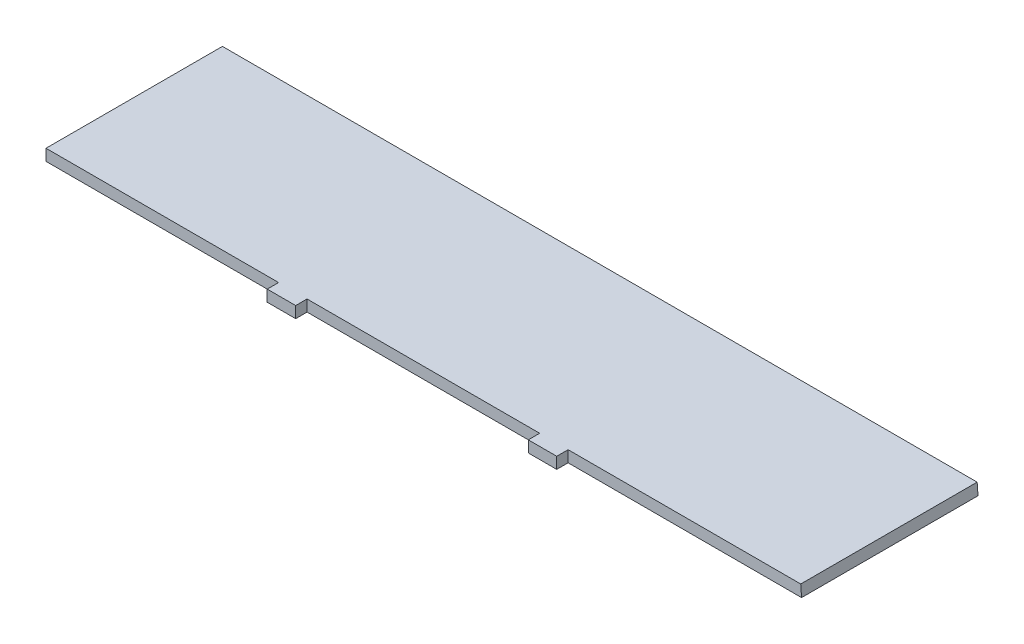
ISO-10303-21;
HEADER;
FILE_DESCRIPTION(('STEP AP214'),'2;1');
FILE_NAME('part.step','',(''),(''),'','','');
FILE_SCHEMA(('AUTOMOTIVE_DESIGN { 1 0 10303 214 1 1 1 1 }'));
ENDSEC;
DATA;
#1=APPLICATION_CONTEXT('core data for automotive mechanical design processes');
#2=APPLICATION_PROTOCOL_DEFINITION('international standard','automotive_design',2000,#1);
#3=PRODUCT_CONTEXT('',#1,'mechanical');
#4=PRODUCT('Part','Part','',(#3));
#5=PRODUCT_RELATED_PRODUCT_CATEGORY('part','',(#4));
#6=PRODUCT_DEFINITION_FORMATION('','',#4);
#7=PRODUCT_DEFINITION_CONTEXT('part definition',#1,'design');
#8=PRODUCT_DEFINITION('design','',#6,#7);
#9=PRODUCT_DEFINITION_SHAPE('','',#8);
#10=(LENGTH_UNIT() NAMED_UNIT(*) SI_UNIT(.MILLI.,.METRE.));
#11=(NAMED_UNIT(*) PLANE_ANGLE_UNIT() SI_UNIT($,.RADIAN.));
#12=(NAMED_UNIT(*) SI_UNIT($,.STERADIAN.) SOLID_ANGLE_UNIT());
#13=UNCERTAINTY_MEASURE_WITH_UNIT(LENGTH_MEASURE(1.E-05),#10,'distance_accuracy_value','');
#14=(GEOMETRIC_REPRESENTATION_CONTEXT(3) GLOBAL_UNCERTAINTY_ASSIGNED_CONTEXT((#13)) GLOBAL_UNIT_ASSIGNED_CONTEXT((#10,
#11,#12)) REPRESENTATION_CONTEXT('',''));
#15=CARTESIAN_POINT('',(0.,0.,0.));
#16=DIRECTION('',(0.,0.,1.));
#17=DIRECTION('',(1.,0.,0.));
#18=AXIS2_PLACEMENT_3D('',#15,#16,#17);
#19=CARTESIAN_POINT('',(380.,-80.,-940.));
#20=DIRECTION('',(0.,0.,-1.));
#21=DIRECTION('',(-1.,0.,0.));
#22=AXIS2_PLACEMENT_3D('',#19,#20,#21);
#23=PLANE('',#22);
#24=DIRECTION('',(1.,0.,0.));
#25=VECTOR('',#24,1.);
#26=CARTESIAN_POINT('',(-420.,-148.,-940.));
#27=LINE('',#26,#25);
#28=CARTESIAN_POINT('',(-376.128490076666,-148.,-940.));
#29=VERTEX_POINT('',#28);
#30=CARTESIAN_POINT('',(-335.256980153332,-148.,-940.));
#31=VERTEX_POINT('',#30);
#32=EDGE_CURVE('E67',#29,#31,#27,.T.);
#33=ORIENTED_EDGE('',*,*,#32,.F.);
#34=DIRECTION('',(0.,1.,0.));
#35=VECTOR('',#34,1.);
#36=CARTESIAN_POINT('',(-376.128490076666,-150.,-940.));
#37=LINE('',#36,#35);
#38=CARTESIAN_POINT('',(-376.128490076666,-150.,-940.));
#39=VERTEX_POINT('',#38);
#40=EDGE_CURVE('E139',#39,#29,#37,.T.);
#41=ORIENTED_EDGE('',*,*,#40,.F.);
#42=DIRECTION('',(-1.,0.,0.));
#43=VECTOR('',#42,1.);
#44=CARTESIAN_POINT('',(380.,-150.,-940.));
#45=LINE('',#44,#43);
#46=CARTESIAN_POINT('',(-335.256980153332,-150.,-940.));
#47=VERTEX_POINT('',#46);
#48=EDGE_CURVE('E148',#47,#39,#45,.T.);
#49=ORIENTED_EDGE('',*,*,#48,.F.);
#50=DIRECTION('',(0.,1.,0.));
#51=VECTOR('',#50,1.);
#52=CARTESIAN_POINT('',(-335.256980153332,-150.,-940.));
#53=LINE('',#52,#51);
#54=EDGE_CURVE('E203',#47,#31,#53,.T.);
#55=ORIENTED_EDGE('',*,*,#54,.T.);
#56=EDGE_LOOP('',(#33,#41,#49,#55));
#57=FACE_BOUND('',#56,.T.);
#58=ADVANCED_FACE('F42',(#57),#23,.F.);
#59=DIRECTION('',(0.,1.,0.));
#60=VECTOR('',#59,1.);
#61=CARTESIAN_POINT('',(-330.256980153332,-150.,-940.));
#62=LINE('',#61,#60);
#63=CARTESIAN_POINT('',(-330.256980153332,-150.,-940.));
#64=VERTEX_POINT('',#63);
#65=CARTESIAN_POINT('',(-330.256980153332,-148.,-940.));
#66=VERTEX_POINT('',#65);
#67=EDGE_CURVE('E201',#64,#66,#62,.T.);
#68=ORIENTED_EDGE('',*,*,#67,.F.);
#69=CARTESIAN_POINT('',(-289.236378340623,-150.,-940.));
#70=VERTEX_POINT('',#69);
#71=EDGE_CURVE('E158',#70,#64,#45,.T.);
#72=ORIENTED_EDGE('',*,*,#71,.F.);
#73=DIRECTION('',(0.0743396744332568,-0.997232978197752,0.));
#74=VECTOR('',#73,1.);
#75=CARTESIAN_POINT('',(-290.727297234372,-130.000000000014,-940.));
#76=LINE('',#75,#74);
#77=CARTESIAN_POINT('',(-289.385470229998,-148.,-940.));
#78=VERTEX_POINT('',#77);
#79=EDGE_CURVE('E162',#78,#70,#76,.T.);
#80=ORIENTED_EDGE('',*,*,#79,.F.);
#81=EDGE_CURVE('E172',#66,#78,#27,.T.);
#82=ORIENTED_EDGE('',*,*,#81,.F.);
#83=EDGE_LOOP('',(#68,#72,#80,#82));
#84=FACE_BOUND('',#83,.T.);
#85=ADVANCED_FACE('F247',(#84),#23,.F.);
#86=CARTESIAN_POINT('',(-381.128490076666,-150.,-940.));
#87=VERTEX_POINT('',#86);
#88=CARTESIAN_POINT('',(-422.,-150.,-940.));
#89=VERTEX_POINT('',#88);
#90=EDGE_CURVE('E159',#87,#89,#45,.T.);
#91=ORIENTED_EDGE('',*,*,#90,.F.);
#92=DIRECTION('',(0.,1.,0.));
#93=VECTOR('',#92,1.);
#94=CARTESIAN_POINT('',(-381.128490076666,-150.,-940.));
#95=LINE('',#94,#93);
#96=CARTESIAN_POINT('',(-381.128490076666,-148.,-940.));
#97=VERTEX_POINT('',#96);
#98=EDGE_CURVE('E149',#87,#97,#95,.T.);
#99=ORIENTED_EDGE('',*,*,#98,.T.);
#100=CARTESIAN_POINT('',(-422.,-148.,-940.));
#101=VERTEX_POINT('',#100);
#102=EDGE_CURVE('E170',#101,#97,#27,.T.);
#103=ORIENTED_EDGE('',*,*,#102,.F.);
#104=DIRECTION('',(0.,1.,0.));
#105=VECTOR('',#104,1.);
#106=CARTESIAN_POINT('',(-422.,-203.,-940.));
#107=LINE('',#106,#105);
#108=EDGE_CURVE('E46',#89,#101,#107,.T.);
#109=ORIENTED_EDGE('',*,*,#108,.F.);
#110=EDGE_LOOP('',(#91,#99,#103,#109));
#111=FACE_BOUND('',#110,.T.);
#112=ADVANCED_FACE('F241',(#111),#23,.F.);
#113=CARTESIAN_POINT('',(-289.385470229998,-148.,-937.989999999988));
#114=DIRECTION('',(0.997232978197752,0.0743396744332568,0.));
#115=DIRECTION('',(-0.0743396744332568,0.997232978197752,0.));
#116=AXIS2_PLACEMENT_3D('',#113,#114,#115);
#117=PLANE('',#116);
#118=DIRECTION('',(0.,0.,1.));
#119=VECTOR('',#118,1.);
#120=CARTESIAN_POINT('',(-289.385470229998,-148.,-971.));
#121=LINE('',#120,#119);
#122=CARTESIAN_POINT('',(-289.385470229998,-148.,-971.));
#123=VERTEX_POINT('',#122);
#124=EDGE_CURVE('E11',#123,#78,#121,.T.);
#125=ORIENTED_EDGE('',*,*,#124,.T.);
#126=ORIENTED_EDGE('',*,*,#79,.T.);
#127=DIRECTION('',(0.,0.,1.));
#128=VECTOR('',#127,1.);
#129=CARTESIAN_POINT('',(-289.236378340623,-150.,-971.));
#130=LINE('',#129,#128);
#131=CARTESIAN_POINT('',(-289.236378340623,-150.,-971.));
#132=VERTEX_POINT('',#131);
#133=EDGE_CURVE('E181',#132,#70,#130,.T.);
#134=ORIENTED_EDGE('',*,*,#133,.F.);
#135=DIRECTION('',(0.0743396744332568,-0.997232978197752,0.));
#136=VECTOR('',#135,1.);
#137=CARTESIAN_POINT('',(-298.758042363078,-22.2712005009367,-971.));
#138=LINE('',#137,#136);
#139=EDGE_CURVE('E166',#123,#132,#138,.T.);
#140=ORIENTED_EDGE('',*,*,#139,.F.);
#141=EDGE_LOOP('',(#125,#126,#134,#140));
#142=FACE_BOUND('',#141,.T.);
#143=ADVANCED_FACE('F44',(#142),#117,.T.);
#144=CARTESIAN_POINT('',(0.,0.,-971.));
#145=DIRECTION('',(0.,0.,-1.));
#146=DIRECTION('',(-1.,0.,0.));
#147=AXIS2_PLACEMENT_3D('',#144,#145,#146);
#148=PLANE('',#147);
#149=DIRECTION('',(1.,0.,0.));
#150=VECTOR('',#149,1.);
#151=CARTESIAN_POINT('',(-420.,-150.,-971.));
#152=LINE('',#151,#150);
#153=CARTESIAN_POINT('',(-422.,-150.,-971.));
#154=VERTEX_POINT('',#153);
#155=EDGE_CURVE('E195',#154,#132,#152,.T.);
#156=ORIENTED_EDGE('',*,*,#155,.F.);
#157=DIRECTION('',(0.,1.,0.));
#158=VECTOR('',#157,1.);
#159=CARTESIAN_POINT('',(-422.,-203.,-971.));
#160=LINE('',#159,#158);
#161=CARTESIAN_POINT('',(-422.,-148.,-971.));
#162=VERTEX_POINT('',#161);
#163=EDGE_CURVE('E176',#154,#162,#160,.T.);
#164=ORIENTED_EDGE('',*,*,#163,.T.);
#165=DIRECTION('',(1.,0.,0.));
#166=VECTOR('',#165,1.);
#167=CARTESIAN_POINT('',(-420.,-148.,-971.));
#168=LINE('',#167,#166);
#169=EDGE_CURVE('E169',#162,#123,#168,.T.);
#170=ORIENTED_EDGE('',*,*,#169,.T.);
#171=ORIENTED_EDGE('',*,*,#139,.T.);
#172=EDGE_LOOP('',(#156,#164,#170,#171));
#173=FACE_BOUND('',#172,.T.);
#174=ADVANCED_FACE('F194',(#173),#148,.T.);
#175=CARTESIAN_POINT('',(-422.,-203.,-971.));
#176=DIRECTION('',(1.,0.,0.));
#177=DIRECTION('',(0.,0.,-1.));
#178=AXIS2_PLACEMENT_3D('',#175,#176,#177);
#179=PLANE('',#178);
#180=DIRECTION('',(0.,0.,-1.));
#181=VECTOR('',#180,1.);
#182=CARTESIAN_POINT('',(-422.,-150.,-971.));
#183=LINE('',#182,#181);
#184=EDGE_CURVE('E51',#89,#154,#183,.T.);
#185=ORIENTED_EDGE('',*,*,#184,.F.);
#186=ORIENTED_EDGE('',*,*,#108,.T.);
#187=DIRECTION('',(0.,0.,1.));
#188=VECTOR('',#187,1.);
#189=CARTESIAN_POINT('',(-422.,-148.,-971.));
#190=LINE('',#189,#188);
#191=EDGE_CURVE('E186',#162,#101,#190,.T.);
#192=ORIENTED_EDGE('',*,*,#191,.F.);
#193=ORIENTED_EDGE('',*,*,#163,.F.);
#194=EDGE_LOOP('',(#185,#186,#192,#193));
#195=FACE_BOUND('',#194,.T.);
#196=ADVANCED_FACE('F244',(#195),#179,.F.);
#197=CARTESIAN_POINT('',(-420.,-148.,-971.));
#198=DIRECTION('',(0.,-1.,0.));
#199=DIRECTION('',(0.,0.,-1.));
#200=AXIS2_PLACEMENT_3D('',#197,#198,#199);
#201=PLANE('',#200);
#202=ORIENTED_EDGE('',*,*,#191,.T.);
#203=ORIENTED_EDGE('',*,*,#102,.T.);
#204=DIRECTION('',(0.,0.,1.));
#205=VECTOR('',#204,1.);
#206=CARTESIAN_POINT('',(-381.128490076666,-148.,-940.));
#207=LINE('',#206,#205);
#208=CARTESIAN_POINT('',(-381.128490076666,-148.,-938.));
#209=VERTEX_POINT('',#208);
#210=EDGE_CURVE('E228',#97,#209,#207,.T.);
#211=ORIENTED_EDGE('',*,*,#210,.T.);
#212=DIRECTION('',(1.,0.,0.));
#213=VECTOR('',#212,1.);
#214=CARTESIAN_POINT('',(-376.128490076666,-148.,-938.));
#215=LINE('',#214,#213);
#216=CARTESIAN_POINT('',(-376.128490076666,-148.,-938.));
#217=VERTEX_POINT('',#216);
#218=EDGE_CURVE('E143',#209,#217,#215,.T.);
#219=ORIENTED_EDGE('',*,*,#218,.T.);
#220=DIRECTION('',(0.,0.,-1.));
#221=VECTOR('',#220,1.);
#222=CARTESIAN_POINT('',(-376.128490076666,-148.,-940.));
#223=LINE('',#222,#221);
#224=EDGE_CURVE('E230',#217,#29,#223,.T.);
#225=ORIENTED_EDGE('',*,*,#224,.T.);
#226=ORIENTED_EDGE('',*,*,#32,.T.);
#227=DIRECTION('',(0.,0.,1.));
#228=VECTOR('',#227,1.);
#229=CARTESIAN_POINT('',(-335.256980153332,-148.,-940.));
#230=LINE('',#229,#228);
#231=CARTESIAN_POINT('',(-335.256980153332,-148.,-938.));
#232=VERTEX_POINT('',#231);
#233=EDGE_CURVE('E213',#31,#232,#230,.T.);
#234=ORIENTED_EDGE('',*,*,#233,.T.);
#235=DIRECTION('',(1.,0.,0.));
#236=VECTOR('',#235,1.);
#237=CARTESIAN_POINT('',(-330.256980153332,-148.,-938.));
#238=LINE('',#237,#236);
#239=CARTESIAN_POINT('',(-330.256980153332,-148.,-938.));
#240=VERTEX_POINT('',#239);
#241=EDGE_CURVE('E209',#232,#240,#238,.T.);
#242=ORIENTED_EDGE('',*,*,#241,.T.);
#243=DIRECTION('',(0.,0.,-1.));
#244=VECTOR('',#243,1.);
#245=CARTESIAN_POINT('',(-330.256980153332,-148.,-940.));
#246=LINE('',#245,#244);
#247=EDGE_CURVE('E215',#240,#66,#246,.T.);
#248=ORIENTED_EDGE('',*,*,#247,.T.);
#249=ORIENTED_EDGE('',*,*,#81,.T.);
#250=ORIENTED_EDGE('',*,*,#124,.F.);
#251=ORIENTED_EDGE('',*,*,#169,.F.);
#252=EDGE_LOOP('',(#202,#203,#211,#219,#225,#226,#234,#242,#248,#249,#250,#251));
#253=FACE_BOUND('',#252,.T.);
#254=ADVANCED_FACE('F239',(#253),#201,.F.);
#255=CARTESIAN_POINT('',(-420.,-150.,-971.));
#256=DIRECTION('',(0.,-1.,0.));
#257=DIRECTION('',(0.,0.,-1.));
#258=AXIS2_PLACEMENT_3D('',#255,#256,#257);
#259=PLANE('',#258);
#260=ORIENTED_EDGE('',*,*,#133,.T.);
#261=ORIENTED_EDGE('',*,*,#71,.T.);
#262=DIRECTION('',(0.,0.,-1.));
#263=VECTOR('',#262,1.);
#264=CARTESIAN_POINT('',(-330.256980153332,-150.,-940.));
#265=LINE('',#264,#263);
#266=CARTESIAN_POINT('',(-330.256980153332,-150.,-938.));
#267=VERTEX_POINT('',#266);
#268=EDGE_CURVE('E212',#267,#64,#265,.T.);
#269=ORIENTED_EDGE('',*,*,#268,.F.);
#270=DIRECTION('',(1.,0.,0.));
#271=VECTOR('',#270,1.);
#272=CARTESIAN_POINT('',(-330.256980153332,-150.,-938.));
#273=LINE('',#272,#271);
#274=CARTESIAN_POINT('',(-335.256980153332,-150.,-938.));
#275=VERTEX_POINT('',#274);
#276=EDGE_CURVE('E204',#275,#267,#273,.T.);
#277=ORIENTED_EDGE('',*,*,#276,.F.);
#278=DIRECTION('',(0.,0.,1.));
#279=VECTOR('',#278,1.);
#280=CARTESIAN_POINT('',(-335.256980153332,-150.,-940.));
#281=LINE('',#280,#279);
#282=EDGE_CURVE('E157',#47,#275,#281,.T.);
#283=ORIENTED_EDGE('',*,*,#282,.F.);
#284=ORIENTED_EDGE('',*,*,#48,.T.);
#285=DIRECTION('',(0.,0.,-1.));
#286=VECTOR('',#285,1.);
#287=CARTESIAN_POINT('',(-376.128490076666,-150.,-940.));
#288=LINE('',#287,#286);
#289=CARTESIAN_POINT('',(-376.128490076666,-150.,-938.));
#290=VERTEX_POINT('',#289);
#291=EDGE_CURVE('E135',#290,#39,#288,.T.);
#292=ORIENTED_EDGE('',*,*,#291,.F.);
#293=DIRECTION('',(1.,0.,0.));
#294=VECTOR('',#293,1.);
#295=CARTESIAN_POINT('',(-376.128490076666,-150.,-938.));
#296=LINE('',#295,#294);
#297=CARTESIAN_POINT('',(-381.128490076666,-150.,-938.));
#298=VERTEX_POINT('',#297);
#299=EDGE_CURVE('E150',#298,#290,#296,.T.);
#300=ORIENTED_EDGE('',*,*,#299,.F.);
#301=DIRECTION('',(0.,0.,1.));
#302=VECTOR('',#301,1.);
#303=CARTESIAN_POINT('',(-381.128490076666,-150.,-940.));
#304=LINE('',#303,#302);
#305=EDGE_CURVE('E59',#87,#298,#304,.T.);
#306=ORIENTED_EDGE('',*,*,#305,.F.);
#307=ORIENTED_EDGE('',*,*,#90,.T.);
#308=ORIENTED_EDGE('',*,*,#184,.T.);
#309=ORIENTED_EDGE('',*,*,#155,.T.);
#310=EDGE_LOOP('',(#260,#261,#269,#277,#283,#284,#292,#300,#306,#307,#308,#309));
#311=FACE_BOUND('',#310,.T.);
#312=ADVANCED_FACE('F154',(#311),#259,.T.);
#313=CARTESIAN_POINT('',(-330.256980153332,-150.,-940.));
#314=DIRECTION('',(1.,0.,0.));
#315=DIRECTION('',(0.,0.,-1.));
#316=AXIS2_PLACEMENT_3D('',#313,#314,#315);
#317=PLANE('',#316);
#318=ORIENTED_EDGE('',*,*,#247,.F.);
#319=DIRECTION('',(0.,1.,0.));
#320=VECTOR('',#319,1.);
#321=CARTESIAN_POINT('',(-330.256980153332,-150.,-938.));
#322=LINE('',#321,#320);
#323=EDGE_CURVE('E163',#267,#240,#322,.T.);
#324=ORIENTED_EDGE('',*,*,#323,.F.);
#325=ORIENTED_EDGE('',*,*,#268,.T.);
#326=ORIENTED_EDGE('',*,*,#67,.T.);
#327=EDGE_LOOP('',(#318,#324,#325,#326));
#328=FACE_BOUND('',#327,.T.);
#329=ADVANCED_FACE('F256',(#328),#317,.T.);
#330=CARTESIAN_POINT('',(-330.256980153332,-150.,-938.));
#331=DIRECTION('',(0.,0.,1.));
#332=DIRECTION('',(1.,0.,0.));
#333=AXIS2_PLACEMENT_3D('',#330,#331,#332);
#334=PLANE('',#333);
#335=ORIENTED_EDGE('',*,*,#241,.F.);
#336=DIRECTION('',(0.,1.,0.));
#337=VECTOR('',#336,1.);
#338=CARTESIAN_POINT('',(-335.256980153332,-150.,-938.));
#339=LINE('',#338,#337);
#340=EDGE_CURVE('E206',#275,#232,#339,.T.);
#341=ORIENTED_EDGE('',*,*,#340,.F.);
#342=ORIENTED_EDGE('',*,*,#276,.T.);
#343=ORIENTED_EDGE('',*,*,#323,.T.);
#344=EDGE_LOOP('',(#335,#341,#342,#343));
#345=FACE_BOUND('',#344,.T.);
#346=ADVANCED_FACE('F252',(#345),#334,.T.);
#347=CARTESIAN_POINT('',(-335.256980153332,-150.,-940.));
#348=DIRECTION('',(-1.,0.,0.));
#349=DIRECTION('',(0.,0.,1.));
#350=AXIS2_PLACEMENT_3D('',#347,#348,#349);
#351=PLANE('',#350);
#352=ORIENTED_EDGE('',*,*,#233,.F.);
#353=ORIENTED_EDGE('',*,*,#54,.F.);
#354=ORIENTED_EDGE('',*,*,#282,.T.);
#355=ORIENTED_EDGE('',*,*,#340,.T.);
#356=EDGE_LOOP('',(#352,#353,#354,#355));
#357=FACE_BOUND('',#356,.T.);
#358=ADVANCED_FACE('F255',(#357),#351,.T.);
#359=CARTESIAN_POINT('',(-376.128490076666,-150.,-940.));
#360=DIRECTION('',(1.,0.,0.));
#361=DIRECTION('',(0.,0.,-1.));
#362=AXIS2_PLACEMENT_3D('',#359,#360,#361);
#363=PLANE('',#362);
#364=ORIENTED_EDGE('',*,*,#224,.F.);
#365=DIRECTION('',(0.,1.,0.));
#366=VECTOR('',#365,1.);
#367=CARTESIAN_POINT('',(-376.128490076666,-150.,-938.));
#368=LINE('',#367,#366);
#369=EDGE_CURVE('E140',#290,#217,#368,.T.);
#370=ORIENTED_EDGE('',*,*,#369,.F.);
#371=ORIENTED_EDGE('',*,*,#291,.T.);
#372=ORIENTED_EDGE('',*,*,#40,.T.);
#373=EDGE_LOOP('',(#364,#370,#371,#372));
#374=FACE_BOUND('',#373,.T.);
#375=ADVANCED_FACE('F138',(#374),#363,.T.);
#376=CARTESIAN_POINT('',(-376.128490076666,-150.,-938.));
#377=DIRECTION('',(0.,0.,1.));
#378=DIRECTION('',(1.,0.,0.));
#379=AXIS2_PLACEMENT_3D('',#376,#377,#378);
#380=PLANE('',#379);
#381=ORIENTED_EDGE('',*,*,#218,.F.);
#382=DIRECTION('',(0.,1.,0.));
#383=VECTOR('',#382,1.);
#384=CARTESIAN_POINT('',(-381.128490076666,-150.,-938.));
#385=LINE('',#384,#383);
#386=EDGE_CURVE('E223',#298,#209,#385,.T.);
#387=ORIENTED_EDGE('',*,*,#386,.F.);
#388=ORIENTED_EDGE('',*,*,#299,.T.);
#389=ORIENTED_EDGE('',*,*,#369,.T.);
#390=EDGE_LOOP('',(#381,#387,#388,#389));
#391=FACE_BOUND('',#390,.T.);
#392=ADVANCED_FACE('F238',(#391),#380,.T.);
#393=CARTESIAN_POINT('',(-381.128490076666,-150.,-940.));
#394=DIRECTION('',(-1.,0.,0.));
#395=DIRECTION('',(0.,0.,1.));
#396=AXIS2_PLACEMENT_3D('',#393,#394,#395);
#397=PLANE('',#396);
#398=ORIENTED_EDGE('',*,*,#210,.F.);
#399=ORIENTED_EDGE('',*,*,#98,.F.);
#400=ORIENTED_EDGE('',*,*,#305,.T.);
#401=ORIENTED_EDGE('',*,*,#386,.T.);
#402=EDGE_LOOP('',(#398,#399,#400,#401));
#403=FACE_BOUND('',#402,.T.);
#404=ADVANCED_FACE('F234',(#403),#397,.T.);
#405=CLOSED_SHELL('',(#58,#85,#112,#143,#174,#196,#254,#312,#329,#346,#358,#375,#392,#404));
#406=MANIFOLD_SOLID_BREP('B2',#405);
#407=ADVANCED_BREP_SHAPE_REPRESENTATION('',(#18,#406),#14);
#408=SHAPE_DEFINITION_REPRESENTATION(#9,#407);
ENDSEC;
END-ISO-10303-21;
